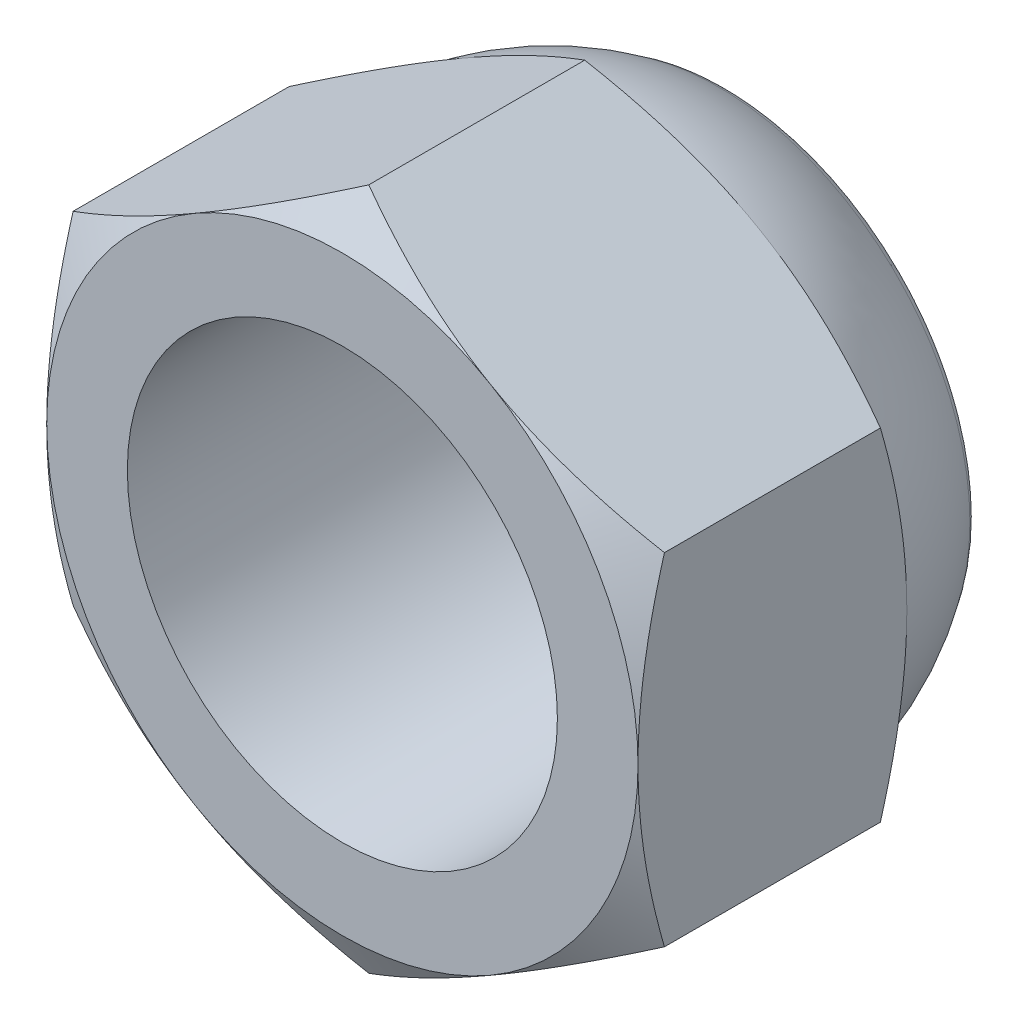
ISO-10303-21;
HEADER;
FILE_DESCRIPTION(('STEP AP214'),'2;1');
FILE_NAME('part.step','',(''),(''),'','','');
FILE_SCHEMA(('AUTOMOTIVE_DESIGN { 1 0 10303 214 1 1 1 1 }'));
ENDSEC;
DATA;
#1=APPLICATION_CONTEXT('core data for automotive mechanical design processes');
#2=APPLICATION_PROTOCOL_DEFINITION('international standard','automotive_design',2000,#1);
#3=PRODUCT_CONTEXT('',#1,'mechanical');
#4=PRODUCT('Part','Part','',(#3));
#5=PRODUCT_RELATED_PRODUCT_CATEGORY('part','',(#4));
#6=PRODUCT_DEFINITION_FORMATION('','',#4);
#7=PRODUCT_DEFINITION_CONTEXT('part definition',#1,'design');
#8=PRODUCT_DEFINITION('design','',#6,#7);
#9=PRODUCT_DEFINITION_SHAPE('','',#8);
#10=(LENGTH_UNIT() NAMED_UNIT(*) SI_UNIT(.MILLI.,.METRE.));
#11=(NAMED_UNIT(*) PLANE_ANGLE_UNIT() SI_UNIT($,.RADIAN.));
#12=(NAMED_UNIT(*) SI_UNIT($,.STERADIAN.) SOLID_ANGLE_UNIT());
#13=UNCERTAINTY_MEASURE_WITH_UNIT(LENGTH_MEASURE(1.E-05),#10,'distance_accuracy_value','');
#14=(GEOMETRIC_REPRESENTATION_CONTEXT(3) GLOBAL_UNCERTAINTY_ASSIGNED_CONTEXT((#13)) GLOBAL_UNIT_ASSIGNED_CONTEXT((#10,
#11,#12)) REPRESENTATION_CONTEXT('',''));
#15=CARTESIAN_POINT('',(0.,0.,0.));
#16=DIRECTION('',(0.,0.,1.));
#17=DIRECTION('',(1.,0.,0.));
#18=AXIS2_PLACEMENT_3D('',#15,#16,#17);
#19=CARTESIAN_POINT('',(0.,3.17542648054295,0.));
#20=DIRECTION('',(0.,0.,-1.));
#21=DIRECTION('',(-1.,0.,0.));
#22=AXIS2_PLACEMENT_3D('',#19,#20,#21);
#23=PLANE('',#22);
#24=CARTESIAN_POINT('',(0.,0.,0.));
#25=DIRECTION('',(0.,0.,-1.));
#26=DIRECTION('',(-1.,0.,0.));
#27=AXIS2_PLACEMENT_3D('',#24,#25,#26);
#28=CIRCLE('',#27,2.);
#29=CARTESIAN_POINT('',(-2.,0.,0.));
#30=VERTEX_POINT('',#29);
#31=EDGE_CURVE('E41',#30,#30,#28,.T.);
#32=ORIENTED_EDGE('',*,*,#31,.T.);
#33=EDGE_LOOP('',(#32));
#34=FACE_BOUND('',#33,.T.);
#35=CARTESIAN_POINT('',(0.,0.,0.));
#36=DIRECTION('',(0.,0.,-1.));
#37=DIRECTION('',(-1.,0.,0.));
#38=AXIS2_PLACEMENT_3D('',#35,#36,#37);
#39=CIRCLE('',#38,2.75);
#40=CARTESIAN_POINT('',(-2.75,0.,0.));
#41=VERTEX_POINT('',#40);
#42=CARTESIAN_POINT('',(-1.37500000000001,2.3815698604072,0.));
#43=VERTEX_POINT('',#42);
#44=EDGE_CURVE('E11',#41,#43,#39,.T.);
#45=ORIENTED_EDGE('',*,*,#44,.F.);
#46=CARTESIAN_POINT('',(-1.37500000000002,-2.3815698604072,0.));
#47=VERTEX_POINT('',#46);
#48=EDGE_CURVE('E47',#47,#41,#39,.T.);
#49=ORIENTED_EDGE('',*,*,#48,.F.);
#50=CARTESIAN_POINT('',(1.375,-2.3815698604072,0.));
#51=VERTEX_POINT('',#50);
#52=EDGE_CURVE('E298',#51,#47,#39,.T.);
#53=ORIENTED_EDGE('',*,*,#52,.F.);
#54=CARTESIAN_POINT('',(2.75,0.,0.));
#55=VERTEX_POINT('',#54);
#56=EDGE_CURVE('E303',#55,#51,#39,.T.);
#57=ORIENTED_EDGE('',*,*,#56,.F.);
#58=CARTESIAN_POINT('',(0.,0.,0.));
#59=DIRECTION('',(0.,0.,1.));
#60=DIRECTION('',(1.,0.,0.));
#61=AXIS2_PLACEMENT_3D('',#58,#59,#60);
#62=CIRCLE('',#61,2.75);
#63=CARTESIAN_POINT('',(1.37500000000002,2.38156986040719,0.));
#64=VERTEX_POINT('',#63);
#65=EDGE_CURVE('E329',#55,#64,#62,.T.);
#66=ORIENTED_EDGE('',*,*,#65,.T.);
#67=EDGE_CURVE('E46',#43,#64,#39,.T.);
#68=ORIENTED_EDGE('',*,*,#67,.F.);
#69=EDGE_LOOP('',(#45,#49,#53,#57,#66,#68));
#70=FACE_BOUND('',#69,.T.);
#71=ADVANCED_FACE('F36',(#34,#70),#23,.F.);
#72=CARTESIAN_POINT('',(0.,3.17542648054295,-2.5));
#73=DIRECTION('',(-0.500000000000004,0.866025403784437,0.));
#74=DIRECTION('',(-0.866025403784437,-0.500000000000004,0.));
#75=AXIS2_PLACEMENT_3D('',#72,#73,#74);
#76=PLANE('',#75);
#77=DIRECTION('',(0.,0.,1.));
#78=VECTOR('',#77,1.);
#79=CARTESIAN_POINT('',(-2.75,1.58771324027146,-2.5));
#80=LINE('',#79,#78);
#81=CARTESIAN_POINT('',(-2.75,1.58771324027149,-2.25437990693813));
#82=VERTEX_POINT('',#81);
#83=CARTESIAN_POINT('',(-2.75,1.58771324027146,-0.245620093061863));
#84=VERTEX_POINT('',#83);
#85=EDGE_CURVE('E293',#82,#84,#80,.T.);
#86=ORIENTED_EDGE('',*,*,#85,.T.);
#87=CARTESIAN_POINT('',(-2.7502,1.58759777021762,-0.245686763364762));
#88=CARTESIAN_POINT('',(-2.62935077934009,1.65737010029698,-0.205387662249264));
#89=CARTESIAN_POINT('',(-2.50745839737737,1.72774469983532,-0.168736902597662));
#90=CARTESIAN_POINT('',(-2.26156287327211,1.86971254687002,-0.1047621829698));
#91=CARTESIAN_POINT('',(-2.13755536142614,1.94130831721582,-0.0774608556744959));
#92=CARTESIAN_POINT('',(-1.89107720202406,2.08361254889598,-0.0349617452941148));
#93=CARTESIAN_POINT('',(-1.76864448141258,2.15429911309864,-0.0194811186224558));
#94=CARTESIAN_POINT('',(-1.52320285763109,2.29600490065922,-0.00099939736993863));
#95=CARTESIAN_POINT('',(-1.40019484676709,2.36702360884403,0.00201700053740195));
#96=CARTESIAN_POINT('',(-1.17034121338921,2.49972966594897,-0.00425314542854563));
#97=CARTESIAN_POINT('',(-1.06346120874598,2.56143686540072,-0.0120001542767018));
#98=CARTESIAN_POINT('',(-0.850397532665248,2.68444923614047,-0.0365551810643557));
#99=CARTESIAN_POINT('',(-0.744214598351108,2.74575398185008,-0.0533715896505722));
#100=CARTESIAN_POINT('',(-0.530711510606812,2.86902004703207,-0.0954119223459603));
#101=CARTESIAN_POINT('',(-0.423418383857139,2.93096576264319,-0.120814080687236));
#102=CARTESIAN_POINT('',(-0.210432520715941,3.05393320806134,-0.178467225839989));
#103=CARTESIAN_POINT('',(-0.104737054973339,3.11495651365996,-0.210704663298991));
#104=CARTESIAN_POINT('',(0.000200000000009354,3.17554195059679,-0.245686763364771));
#105=B_SPLINE_CURVE_WITH_KNOTS('',3,(#87,#88,#89,#90,#91,#92,#93,#94,#95,#96,#97,#98,#99,#100,
#101,#102,#103,#104),.UNSPECIFIED.,.F.,.F.,(4,2,2,2,2,2,2,2,4),(0.,0.435912828725889,
0.872873557116333,1.29901931904672,1.72464171213574,2.09526089052938,2.46622354066375,
2.84541551798559,3.22386274754526),.UNSPECIFIED.);
#106=EDGE_CURVE('E256',#84,#43,#105,.T.);
#107=ORIENTED_EDGE('',*,*,#106,.T.);
#108=CARTESIAN_POINT('',(0.,3.17542648054295,-0.245620093061873));
#109=VERTEX_POINT('',#108);
#110=EDGE_CURVE('E54',#43,#109,#105,.T.);
#111=ORIENTED_EDGE('',*,*,#110,.T.);
#112=DIRECTION('',(0.,0.,1.));
#113=VECTOR('',#112,1.);
#114=CARTESIAN_POINT('',(0.,3.17542648054295,-2.5));
#115=LINE('',#114,#113);
#116=CARTESIAN_POINT('',(0.,3.17542648054295,-2.25437990693813));
#117=VERTEX_POINT('',#116);
#118=EDGE_CURVE('E280',#117,#109,#115,.T.);
#119=ORIENTED_EDGE('',*,*,#118,.F.);
#120=CARTESIAN_POINT('',(-2.7502,1.58759777021762,-2.25431323663524));
#121=CARTESIAN_POINT('',(-2.62935077934009,1.65737010029698,-2.29461233775074));
#122=CARTESIAN_POINT('',(-2.50745839737737,1.72774469983532,-2.33126309740234));
#123=CARTESIAN_POINT('',(-2.26156287327211,1.86971254687002,-2.3952378170302));
#124=CARTESIAN_POINT('',(-2.13755536142615,1.94130831721582,-2.42253914432551));
#125=CARTESIAN_POINT('',(-1.89107720202406,2.08361254889598,-2.46503825470589));
#126=CARTESIAN_POINT('',(-1.76864448141258,2.15429911309863,-2.48051888137754));
#127=CARTESIAN_POINT('',(-1.52320285763109,2.29600490065922,-2.49900060263006));
#128=CARTESIAN_POINT('',(-1.40019484676709,2.36702360884403,-2.5020170005374));
#129=CARTESIAN_POINT('',(-1.17034121338921,2.49972966594897,-2.49574685457145));
#130=CARTESIAN_POINT('',(-1.06346120874598,2.56143686540072,-2.4879998457233));
#131=CARTESIAN_POINT('',(-0.85039753266525,2.68444923614047,-2.46344481893565));
#132=CARTESIAN_POINT('',(-0.744214598351109,2.74575398185008,-2.44662841034943));
#133=CARTESIAN_POINT('',(-0.530711510606812,2.86902004703207,-2.40458807765404));
#134=CARTESIAN_POINT('',(-0.42341838385714,2.93096576264319,-2.37918591931277));
#135=CARTESIAN_POINT('',(-0.210432520715941,3.05393320806134,-2.32153277416001));
#136=CARTESIAN_POINT('',(-0.104737054973339,3.11495651365996,-2.28929533670101));
#137=CARTESIAN_POINT('',(0.000200000000009504,3.17554195059679,-2.25431323663523));
#138=B_SPLINE_CURVE_WITH_KNOTS('',3,(#120,#121,#122,#123,#124,#125,#126,#127,#128,#129,#130,
#131,#132,#133,#134,#135,#136,#137),.UNSPECIFIED.,.F.,.F.,(4,2,2,2,2,2,2,2,4),(0.,
0.435912828725888,0.872873557116332,1.29901931904671,1.72464171213573,2.09526089052938,
2.46622354066375,2.84541551798559,3.22386274754526),.UNSPECIFIED.);
#139=CARTESIAN_POINT('',(-1.37500000000001,2.38156986040721,-2.5));
#140=VERTEX_POINT('',#139);
#141=EDGE_CURVE('E165',#140,#117,#138,.T.);
#142=ORIENTED_EDGE('',*,*,#141,.F.);
#143=EDGE_CURVE('E148',#82,#140,#138,.T.);
#144=ORIENTED_EDGE('',*,*,#143,.F.);
#145=EDGE_LOOP('',(#86,#107,#111,#119,#142,#144));
#146=FACE_BOUND('',#145,.T.);
#147=ADVANCED_FACE('F38',(#146),#76,.T.);
#148=CARTESIAN_POINT('',(2.75,1.58771324027145,-2.5));
#149=DIRECTION('',(0.500000000000009,0.866025403784433,0.));
#150=DIRECTION('',(-0.866025403784433,0.500000000000009,0.));
#151=AXIS2_PLACEMENT_3D('',#148,#149,#150);
#152=PLANE('',#151);
#153=ORIENTED_EDGE('',*,*,#118,.T.);
#154=CARTESIAN_POINT('',(-0.000199999999990853,3.17554195059679,-0.245686763364771));
#155=CARTESIAN_POINT('',(0.120649220659915,3.10576962051743,-0.205387662249272));
#156=CARTESIAN_POINT('',(0.242541602622642,3.03539502097909,-0.16873690259767));
#157=CARTESIAN_POINT('',(0.488437126727901,2.89342717394439,-0.104762182969806));
#158=CARTESIAN_POINT('',(0.612444638573864,2.82183140359859,-0.0774608556745009));
#159=CARTESIAN_POINT('',(0.858922797975952,2.67952717191842,-0.0349617452941181));
#160=CARTESIAN_POINT('',(0.981355518587425,2.60884060771577,-0.0194811186224582));
#161=CARTESIAN_POINT('',(1.22679714236892,2.46713482015518,-0.000999397369939208));
#162=CARTESIAN_POINT('',(1.34980515323292,2.39611611197037,0.00201700053740231));
#163=CARTESIAN_POINT('',(1.5796587866108,2.26341005486543,-0.00425314542854391));
#164=CARTESIAN_POINT('',(1.68653879125403,2.20170285541367,-0.0120001542766995));
#165=CARTESIAN_POINT('',(1.89960246733476,2.07869048467393,-0.0365551810643516));
#166=CARTESIAN_POINT('',(2.00578540164889,2.01738573896432,-0.053371589650567));
#167=CARTESIAN_POINT('',(2.21928848939319,1.89411967378233,-0.0954119223459532));
#168=CARTESIAN_POINT('',(2.32658161614286,1.83217395817121,-0.120814080687228));
#169=CARTESIAN_POINT('',(2.53956747928405,1.70920651275305,-0.17846722583998));
#170=CARTESIAN_POINT('',(2.64526294502665,1.64818320715444,-0.210704663298981));
#171=CARTESIAN_POINT('',(2.7502,1.58759777021761,-0.245686763364759));
#172=B_SPLINE_CURVE_WITH_KNOTS('',3,(#154,#155,#156,#157,#158,#159,#160,#161,#162,#163,#164,
#165,#166,#167,#168,#169,#170,#171),.UNSPECIFIED.,.F.,.F.,(4,2,2,2,2,2,2,2,4),(0.,
0.435912828725891,0.872873557116338,1.29901931904672,1.72464171213575,2.09526089052939,
2.46622354066375,2.84541551798558,3.22386274754526),.UNSPECIFIED.);
#173=EDGE_CURVE('E268',#109,#64,#172,.T.);
#174=ORIENTED_EDGE('',*,*,#173,.T.);
#175=CARTESIAN_POINT('',(2.75,1.58771324027149,-0.245620093061873));
#176=VERTEX_POINT('',#175);
#177=EDGE_CURVE('E61',#64,#176,#172,.T.);
#178=ORIENTED_EDGE('',*,*,#177,.T.);
#179=DIRECTION('',(0.,0.,1.));
#180=VECTOR('',#179,1.);
#181=CARTESIAN_POINT('',(2.75,1.58771324027145,-2.5));
#182=LINE('',#181,#180);
#183=CARTESIAN_POINT('',(2.75,1.58771324027149,-2.25437990693813));
#184=VERTEX_POINT('',#183);
#185=EDGE_CURVE('E284',#184,#176,#182,.T.);
#186=ORIENTED_EDGE('',*,*,#185,.F.);
#187=CARTESIAN_POINT('',(-0.000199999999990713,3.17554195059679,-2.25431323663523));
#188=CARTESIAN_POINT('',(0.120649220659915,3.10576962051743,-2.29461233775073));
#189=CARTESIAN_POINT('',(0.242541602622642,3.03539502097909,-2.33126309740233));
#190=CARTESIAN_POINT('',(0.488437126727901,2.89342717394439,-2.3952378170302));
#191=CARTESIAN_POINT('',(0.612444638573863,2.82183140359859,-2.4225391443255));
#192=CARTESIAN_POINT('',(0.85892279797595,2.67952717191842,-2.46503825470588));
#193=CARTESIAN_POINT('',(0.981355518587423,2.60884060771577,-2.48051888137754));
#194=CARTESIAN_POINT('',(1.22679714236892,2.46713482015518,-2.49900060263006));
#195=CARTESIAN_POINT('',(1.34980515323292,2.39611611197037,-2.5020170005374));
#196=CARTESIAN_POINT('',(1.5796587866108,2.26341005486543,-2.49574685457146));
#197=CARTESIAN_POINT('',(1.68653879125403,2.20170285541368,-2.4879998457233));
#198=CARTESIAN_POINT('',(1.89960246733475,2.07869048467393,-2.46344481893565));
#199=CARTESIAN_POINT('',(2.00578540164889,2.01738573896432,-2.44662841034943));
#200=CARTESIAN_POINT('',(2.21928848939319,1.89411967378233,-2.40458807765405));
#201=CARTESIAN_POINT('',(2.32658161614286,1.83217395817121,-2.37918591931277));
#202=CARTESIAN_POINT('',(2.53956747928405,1.70920651275305,-2.32153277416002));
#203=CARTESIAN_POINT('',(2.64526294502666,1.64818320715444,-2.28929533670102));
#204=CARTESIAN_POINT('',(2.7502,1.58759777021761,-2.25431323663524));
#205=B_SPLINE_CURVE_WITH_KNOTS('',3,(#187,#188,#189,#190,#191,#192,#193,#194,#195,#196,#197,
#198,#199,#200,#201,#202,#203,#204),.UNSPECIFIED.,.F.,.F.,(4,2,2,2,2,2,2,2,4),(0.,
0.43591282872589,0.872873557116336,1.29901931904672,1.72464171213574,2.09526089052938,
2.46622354066375,2.84541551798558,3.22386274754526),.UNSPECIFIED.);
#206=CARTESIAN_POINT('',(1.37500000000003,2.38156986040719,-2.5));
#207=VERTEX_POINT('',#206);
#208=EDGE_CURVE('E143',#207,#184,#205,.T.);
#209=ORIENTED_EDGE('',*,*,#208,.F.);
#210=EDGE_CURVE('E279',#117,#207,#205,.T.);
#211=ORIENTED_EDGE('',*,*,#210,.F.);
#212=EDGE_LOOP('',(#153,#174,#178,#186,#209,#211));
#213=FACE_BOUND('',#212,.T.);
#214=ADVANCED_FACE('F269',(#213),#152,.T.);
#215=CARTESIAN_POINT('',(2.75,1.58771324027145,-2.5));
#216=DIRECTION('',(-1.,0.,0.));
#217=DIRECTION('',(0.,0.,1.));
#218=AXIS2_PLACEMENT_3D('',#215,#216,#217);
#219=PLANE('',#218);
#220=CARTESIAN_POINT('',(2.75,-4.2108494930968,-1.31594843960298));
#221=CARTESIAN_POINT('',(2.75,-4.09010894214094,-1.25759993615228));
#222=CARTESIAN_POINT('',(2.75,-3.96908292065513,-1.19983146511762));
#223=CARTESIAN_POINT('',(2.75,-3.72630558284848,-1.08578603842309));
#224=CARTESIAN_POINT('',(2.75,-3.60455414536204,-1.02950934100251));
#225=CARTESIAN_POINT('',(2.75,-3.35951393034358,-0.91848244335279));
#226=CARTESIAN_POINT('',(2.75,-3.2362203423644,-0.86374282160587));
#227=CARTESIAN_POINT('',(2.75,-2.98861980138747,-0.756614777476483));
#228=CARTESIAN_POINT('',(2.75,-2.86431290161186,-0.704226232536791));
#229=CARTESIAN_POINT('',(2.75,-2.61294485887175,-0.601803572146148));
#230=CARTESIAN_POINT('',(2.75,-2.48586863815658,-0.551806257898417));
#231=CARTESIAN_POINT('',(2.75,-2.23021732171544,-0.455727408784622));
#232=CARTESIAN_POINT('',(2.75,-2.10164206103367,-0.409646309576991));
#233=CARTESIAN_POINT('',(2.75,-1.8430521879947,-0.322638077046248));
#234=CARTESIAN_POINT('',(2.75,-1.71304130052586,-0.281699986413904));
#235=CARTESIAN_POINT('',(2.75,-1.45117125062151,-0.206307307624361));
#236=CARTESIAN_POINT('',(2.75,-1.31931268690205,-0.171850669152779));
#237=CARTESIAN_POINT('',(2.75,-1.05365722480015,-0.111093671530913));
#238=CARTESIAN_POINT('',(2.75,-0.919859820217618,-0.0847954840951296));
#239=CARTESIAN_POINT('',(2.75,-0.650651874037407,-0.0421260371966173));
#240=CARTESIAN_POINT('',(2.75,-0.51524133101362,-0.0257547865105482));
#241=CARTESIAN_POINT('',(2.75,-0.244373242869234,-0.00438749654024083));
#242=CARTESIAN_POINT('',(2.75,-0.108921526377156,0.000680556773213286));
#243=CARTESIAN_POINT('',(2.75,0.161887058855113,-0.000827795632673346));
#244=CARTESIAN_POINT('',(2.75,0.297243943089621,-0.00740117868555447));
#245=CARTESIAN_POINT('',(2.75,0.528385436717521,-0.0281041300468438));
#246=CARTESIAN_POINT('',(2.75,0.624425050137477,-0.0395376410301878));
#247=CARTESIAN_POINT('',(2.75,0.815762399811515,-0.0675217196133493));
#248=CARTESIAN_POINT('',(2.75,0.911060016631936,-0.08407309422768));
#249=CARTESIAN_POINT('',(2.75,1.19576218748913,-0.14053536127828));
#250=CARTESIAN_POINT('',(2.75,1.38383224738492,-0.187239859417288));
#251=CARTESIAN_POINT('',(2.75,1.6652504894748,-0.26779249703057));
#252=CARTESIAN_POINT('',(2.75,1.76006556248553,-0.296803334995491));
#253=CARTESIAN_POINT('',(2.75,1.9487060938221,-0.357695648906576));
#254=CARTESIAN_POINT('',(2.75,2.0425321855369,-0.389575144878491));
#255=CARTESIAN_POINT('',(2.75,2.22880240354978,-0.455541418186435));
#256=CARTESIAN_POINT('',(2.75,2.32125133588445,-0.489614761455518));
#257=CARTESIAN_POINT('',(2.75,2.50543192042622,-0.559761368231093));
#258=CARTESIAN_POINT('',(2.75,2.59716326539572,-0.595835440037301));
#259=CARTESIAN_POINT('',(2.75,2.68856293053338,-0.632712441997466));
#260=B_SPLINE_CURVE_WITH_KNOTS('',3,(#220,#221,#222,#223,#224,#225,#226,#227,#228,#229,#230,
#231,#232,#233,#234,#235,#236,#237,#238,#239,#240,#241,#242,#243,#244,#245,#246,#247,#248,#249,
#250,#251,#252,#253,#254,#255,#256,#257,#258,#259),.UNSPECIFIED.,.F.,.F.,(4,2,2,2,2,2,2,2,2,2,2,
2,2,2,2,2,2,2,2,4),(0.,0.402305607365938,0.804680408537001,1.20935783819119,1.61401414820819,
2.02363838185771,2.4333081245735,2.84208969479602,3.25074173456638,3.65950246109146,
4.06826354901186,4.47441284024653,4.88045669141175,5.17046846817548,5.46052599902454,
6.04107275309883,6.33851131304661,6.63574613017454,6.9313079100579,7.2269899800482),.UNSPECIFIED.);
#261=CARTESIAN_POINT('',(2.74999999999998,-1.58771324027152,-0.245620093061873));
#262=VERTEX_POINT('',#261);
#263=EDGE_CURVE('E250',#262,#55,#260,.T.);
#264=ORIENTED_EDGE('',*,*,#263,.F.);
#265=DIRECTION('',(0.,0.,1.));
#266=VECTOR('',#265,1.);
#267=CARTESIAN_POINT('',(2.75,-1.58771324027151,-2.5));
#268=LINE('',#267,#266);
#269=CARTESIAN_POINT('',(2.74999999999998,-1.58771324027152,-2.25437990693813));
#270=VERTEX_POINT('',#269);
#271=EDGE_CURVE('E162',#270,#262,#268,.T.);
#272=ORIENTED_EDGE('',*,*,#271,.F.);
#273=CARTESIAN_POINT('',(2.75,-4.2108494930968,-1.18405156039704));
#274=CARTESIAN_POINT('',(2.75,-4.09010894214094,-1.24240006384774));
#275=CARTESIAN_POINT('',(2.75,-3.96908292065513,-1.30016853488239));
#276=CARTESIAN_POINT('',(2.75,-3.72630558284847,-1.41421396157693));
#277=CARTESIAN_POINT('',(2.75,-3.60455414536204,-1.47049065899751));
#278=CARTESIAN_POINT('',(2.75,-3.35951393034358,-1.58151755664722));
#279=CARTESIAN_POINT('',(2.75,-3.2362203423644,-1.63625717839414));
#280=CARTESIAN_POINT('',(2.75,-2.98861980138747,-1.74338522252353));
#281=CARTESIAN_POINT('',(2.75,-2.86431290161185,-1.79577376746322));
#282=CARTESIAN_POINT('',(2.75,-2.61294485887175,-1.89819642785386));
#283=CARTESIAN_POINT('',(2.75,-2.48586863815658,-1.94819374210159));
#284=CARTESIAN_POINT('',(2.75,-2.23021732171544,-2.04427259121539));
#285=CARTESIAN_POINT('',(2.75,-2.10164206103366,-2.09035369042302));
#286=CARTESIAN_POINT('',(2.75,-1.8430521879947,-2.17736192295376));
#287=CARTESIAN_POINT('',(2.75,-1.71304130052586,-2.2183000135861));
#288=CARTESIAN_POINT('',(2.75,-1.45117125062151,-2.29369269237564));
#289=CARTESIAN_POINT('',(2.75,-1.31931268690205,-2.32814933084722));
#290=CARTESIAN_POINT('',(2.75,-1.05365722480015,-2.38890632846909));
#291=CARTESIAN_POINT('',(2.75,-0.919859820217619,-2.41520451590487));
#292=CARTESIAN_POINT('',(2.75,-0.650651874037408,-2.45787396280338));
#293=CARTESIAN_POINT('',(2.75,-0.515241331013621,-2.47424521348945));
#294=CARTESIAN_POINT('',(2.75,-0.244373242869236,-2.49561250345976));
#295=CARTESIAN_POINT('',(2.75,-0.108921526377157,-2.50068055677321));
#296=CARTESIAN_POINT('',(2.75,0.161887058855112,-2.49917220436733));
#297=CARTESIAN_POINT('',(2.75,0.297243943089618,-2.49259882131445));
#298=CARTESIAN_POINT('',(2.75,0.52838543671752,-2.47189586995316));
#299=CARTESIAN_POINT('',(2.75,0.624425050137477,-2.46046235896981));
#300=CARTESIAN_POINT('',(2.75,0.815762399811518,-2.43247828038665));
#301=CARTESIAN_POINT('',(2.75,0.911060016631939,-2.41592690577232));
#302=CARTESIAN_POINT('',(2.75,1.19576218748913,-2.35946463872172));
#303=CARTESIAN_POINT('',(2.75,1.38383224738494,-2.31276014058271));
#304=CARTESIAN_POINT('',(2.75,1.66525048947482,-2.23220750296943));
#305=CARTESIAN_POINT('',(2.75,1.76006556248554,-2.20319666500451));
#306=CARTESIAN_POINT('',(2.75,1.94870609382212,-2.14230435109342));
#307=CARTESIAN_POINT('',(2.75,2.04253218553692,-2.11042485512151));
#308=CARTESIAN_POINT('',(2.75,2.22880240354981,-2.04445858181356));
#309=CARTESIAN_POINT('',(2.75,2.32125133588447,-2.01038523854448));
#310=CARTESIAN_POINT('',(2.75,2.50543192042624,-1.9402386317689));
#311=CARTESIAN_POINT('',(2.75,2.59716326539575,-1.9041645599627));
#312=CARTESIAN_POINT('',(2.75,2.68856293053341,-1.86728755800253));
#313=B_SPLINE_CURVE_WITH_KNOTS('',3,(#273,#274,#275,#276,#277,#278,#279,#280,#281,#282,#283,
#284,#285,#286,#287,#288,#289,#290,#291,#292,#293,#294,#295,#296,#297,#298,#299,#300,#301,#302,
#303,#304,#305,#306,#307,#308,#309,#310,#311,#312),.UNSPECIFIED.,.F.,.F.,(4,2,2,2,2,2,2,2,2,2,2,
2,2,2,2,2,2,2,2,4),(0.,0.402305607365938,0.804680408537,1.20935783819118,1.61401414820819,
2.02363838185771,2.4333081245735,2.84208969479602,3.25074173456638,3.65950246109145,
4.06826354901186,4.47441284024652,4.88045669141174,5.17046846817548,5.46052599902454,
6.04107275309884,6.33851131304662,6.63574613017455,6.93130791005792,7.22698998004822),.UNSPECIFIED.);
#314=CARTESIAN_POINT('',(2.75,0.,-2.5));
#315=VERTEX_POINT('',#314);
#316=EDGE_CURVE('E150',#270,#315,#313,.T.);
#317=ORIENTED_EDGE('',*,*,#316,.T.);
#318=EDGE_CURVE('E141',#315,#184,#313,.T.);
#319=ORIENTED_EDGE('',*,*,#318,.T.);
#320=ORIENTED_EDGE('',*,*,#185,.T.);
#321=EDGE_CURVE('E257',#55,#176,#260,.T.);
#322=ORIENTED_EDGE('',*,*,#321,.F.);
#323=EDGE_LOOP('',(#264,#272,#317,#319,#320,#322));
#324=FACE_BOUND('',#323,.T.);
#325=ADVANCED_FACE('F160',(#324),#219,.F.);
#326=CARTESIAN_POINT('',(0.,-3.17542648054299,-2.5));
#327=DIRECTION('',(0.500000000000002,-0.866025403784438,0.));
#328=DIRECTION('',(0.866025403784438,0.500000000000002,0.));
#329=AXIS2_PLACEMENT_3D('',#326,#327,#328);
#330=PLANE('',#329);
#331=ORIENTED_EDGE('',*,*,#271,.T.);
#332=CARTESIAN_POINT('',(2.7502,-1.58759777021767,-0.245686763364776));
#333=CARTESIAN_POINT('',(2.6293507793401,-1.65737010029702,-0.205387662249279));
#334=CARTESIAN_POINT('',(2.50745839737737,-1.72774469983537,-0.168736902597678));
#335=CARTESIAN_POINT('',(2.26156287327211,-1.86971254687007,-0.104762182969816));
#336=CARTESIAN_POINT('',(2.13755536142614,-1.94130831721587,-0.0774608556745131));
#337=CARTESIAN_POINT('',(1.89107720202405,-2.08361254889603,-0.0349617452941333));
#338=CARTESIAN_POINT('',(1.76864448141258,-2.15429911309868,-0.0194811186224748));
#339=CARTESIAN_POINT('',(1.52320285763108,-2.29600490065927,-0.000999397369959125));
#340=CARTESIAN_POINT('',(1.40019484676708,-2.36702360884408,0.00201700053738049));
#341=CARTESIAN_POINT('',(1.1703412133892,-2.49972966594901,-0.00425314542856856));
#342=CARTESIAN_POINT('',(1.06346120874597,-2.56143686540077,-0.012000154276725));
#343=CARTESIAN_POINT('',(0.850397532665243,-2.68444923614051,-0.0365551810643791));
#344=CARTESIAN_POINT('',(0.744214598351104,-2.74575398185012,-0.0533715896505955));
#345=CARTESIAN_POINT('',(0.530711510606811,-2.86902004703211,-0.0954119223459832));
#346=CARTESIAN_POINT('',(0.42341838385714,-2.93096576264323,-0.120814080687258));
#347=CARTESIAN_POINT('',(0.210432520715946,-3.05393320806138,-0.178467225840011));
#348=CARTESIAN_POINT('',(0.104737054973345,-3.11495651366,-0.210704663299012));
#349=CARTESIAN_POINT('',(-0.000200000000002151,-3.17554195059682,-0.245686763364791));
#350=B_SPLINE_CURVE_WITH_KNOTS('',3,(#332,#333,#334,#335,#336,#337,#338,#339,#340,#341,#342,
#343,#344,#345,#346,#347,#348,#349),.UNSPECIFIED.,.F.,.F.,(4,2,2,2,2,2,2,2,4),(0.,
0.435912828725892,0.872873557116341,1.29901931904673,1.72464171213575,2.09526089052939,
2.46622354066376,2.84541551798558,3.22386274754525),.UNSPECIFIED.);
#351=EDGE_CURVE('E249',#262,#51,#350,.T.);
#352=ORIENTED_EDGE('',*,*,#351,.T.);
#353=CARTESIAN_POINT('',(0.,-3.17542648054295,-0.245620093061873));
#354=VERTEX_POINT('',#353);
#355=EDGE_CURVE('E242',#51,#354,#350,.T.);
#356=ORIENTED_EDGE('',*,*,#355,.T.);
#357=DIRECTION('',(0.,0.,1.));
#358=VECTOR('',#357,1.);
#359=CARTESIAN_POINT('',(0.,-3.17542648054299,-2.5));
#360=LINE('',#359,#358);
#361=CARTESIAN_POINT('',(0.,-3.17542648054295,-2.25437990693813));
#362=VERTEX_POINT('',#361);
#363=EDGE_CURVE('E287',#362,#354,#360,.T.);
#364=ORIENTED_EDGE('',*,*,#363,.F.);
#365=CARTESIAN_POINT('',(2.7502,-1.58759777021767,-2.25431323663523));
#366=CARTESIAN_POINT('',(2.6293507793401,-1.65737010029702,-2.29461233775072));
#367=CARTESIAN_POINT('',(2.50745839737737,-1.72774469983537,-2.33126309740233));
#368=CARTESIAN_POINT('',(2.26156287327211,-1.86971254687006,-2.39523781703019));
#369=CARTESIAN_POINT('',(2.13755536142614,-1.94130831721587,-2.42253914432549));
#370=CARTESIAN_POINT('',(1.89107720202405,-2.08361254889603,-2.46503825470587));
#371=CARTESIAN_POINT('',(1.76864448141258,-2.15429911309868,-2.48051888137753));
#372=CARTESIAN_POINT('',(1.52320285763108,-2.29600490065927,-2.49900060263004));
#373=CARTESIAN_POINT('',(1.40019484676708,-2.36702360884408,-2.50201700053738));
#374=CARTESIAN_POINT('',(1.1703412133892,-2.49972966594901,-2.49574685457143));
#375=CARTESIAN_POINT('',(1.06346120874597,-2.56143686540077,-2.48799984572328));
#376=CARTESIAN_POINT('',(0.850397532665244,-2.68444923614051,-2.46344481893562));
#377=CARTESIAN_POINT('',(0.744214598351105,-2.74575398185012,-2.44662841034941));
#378=CARTESIAN_POINT('',(0.530711510606812,-2.86902004703211,-2.40458807765402));
#379=CARTESIAN_POINT('',(0.423418383857141,-2.93096576264323,-2.37918591931274));
#380=CARTESIAN_POINT('',(0.210432520715946,-3.05393320806138,-2.32153277415999));
#381=CARTESIAN_POINT('',(0.104737054973345,-3.11495651366,-2.28929533670099));
#382=CARTESIAN_POINT('',(-0.000200000000002157,-3.17554195059682,-2.25431323663521));
#383=B_SPLINE_CURVE_WITH_KNOTS('',3,(#365,#366,#367,#368,#369,#370,#371,#372,#373,#374,#375,
#376,#377,#378,#379,#380,#381,#382),.UNSPECIFIED.,.F.,.F.,(4,2,2,2,2,2,2,2,4),(0.,
0.435912828725891,0.872873557116339,1.29901931904673,1.72464171213575,2.09526089052939,
2.46622354066375,2.84541551798558,3.22386274754525),.UNSPECIFIED.);
#384=CARTESIAN_POINT('',(1.37500000000001,-2.38156986040721,-2.5));
#385=VERTEX_POINT('',#384);
#386=EDGE_CURVE('E166',#385,#362,#383,.T.);
#387=ORIENTED_EDGE('',*,*,#386,.F.);
#388=EDGE_CURVE('E154',#270,#385,#383,.T.);
#389=ORIENTED_EDGE('',*,*,#388,.F.);
#390=EDGE_LOOP('',(#331,#352,#356,#364,#387,#389));
#391=FACE_BOUND('',#390,.T.);
#392=ADVANCED_FACE('F220',(#391),#330,.T.);
#393=CARTESIAN_POINT('',(-2.75,-1.58771324027149,-2.5));
#394=DIRECTION('',(-0.500000000000006,-0.866025403784435,0.));
#395=DIRECTION('',(0.866025403784435,-0.500000000000006,0.));
#396=AXIS2_PLACEMENT_3D('',#393,#394,#395);
#397=PLANE('',#396);
#398=ORIENTED_EDGE('',*,*,#363,.T.);
#399=CARTESIAN_POINT('',(0.000199999999997729,-3.17554195059682,-0.245686763364791));
#400=CARTESIAN_POINT('',(-0.12064922065991,-3.10576962051747,-0.205387662249292));
#401=CARTESIAN_POINT('',(-0.242541602622639,-3.03539502097912,-0.168736902597689));
#402=CARTESIAN_POINT('',(-0.4884371267279,-2.89342717394442,-0.104762182969824));
#403=CARTESIAN_POINT('',(-0.612444638573865,-2.82183140359862,-0.0774608556745193));
#404=CARTESIAN_POINT('',(-0.858922797975956,-2.67952717191845,-0.0349617452941363));
#405=CARTESIAN_POINT('',(-0.981355518587431,-2.6088406077158,-0.0194811186224764));
#406=CARTESIAN_POINT('',(-1.22679714236893,-2.46713482015521,-0.000999397369957548));
#407=CARTESIAN_POINT('',(-1.34980515323293,-2.3961161119704,0.00201700053738388));
#408=CARTESIAN_POINT('',(-1.57965878661081,-2.26341005486546,-0.00425314542856246));
#409=CARTESIAN_POINT('',(-1.68653879125404,-2.20170285541371,-0.0120001542767178));
#410=CARTESIAN_POINT('',(-1.89960246733476,-2.07869048467397,-0.0365551810643694));
#411=CARTESIAN_POINT('',(-2.0057854016489,-2.01738573896435,-0.0533715896505844));
#412=CARTESIAN_POINT('',(-2.21928848939319,-1.89411967378237,-0.0954119223459692));
#413=CARTESIAN_POINT('',(-2.32658161614286,-1.83217395817125,-0.120814080687243));
#414=CARTESIAN_POINT('',(-2.53956747928405,-1.7092065127531,-0.178467225839993));
#415=CARTESIAN_POINT('',(-2.64526294502665,-1.64818320715448,-0.210704663298993));
#416=CARTESIAN_POINT('',(-2.7502,-1.58759777021765,-0.245686763364771));
#417=B_SPLINE_CURVE_WITH_KNOTS('',3,(#399,#400,#401,#402,#403,#404,#405,#406,#407,#408,#409,
#410,#411,#412,#413,#414,#415,#416),.UNSPECIFIED.,.F.,.F.,(4,2,2,2,2,2,2,2,4),(0.,
0.435912828725896,0.872873557116347,1.29901931904674,1.72464171213576,2.0952608905294,
2.46622354066376,2.84541551798559,3.22386274754525),.UNSPECIFIED.);
#418=EDGE_CURVE('E234',#354,#47,#417,.T.);
#419=ORIENTED_EDGE('',*,*,#418,.T.);
#420=CARTESIAN_POINT('',(-2.75,-1.58771324027149,-0.245620093061873));
#421=VERTEX_POINT('',#420);
#422=EDGE_CURVE('E226',#47,#421,#417,.T.);
#423=ORIENTED_EDGE('',*,*,#422,.T.);
#424=DIRECTION('',(0.,0.,1.));
#425=VECTOR('',#424,1.);
#426=CARTESIAN_POINT('',(-2.75,-1.58771324027149,-2.5));
#427=LINE('',#426,#425);
#428=CARTESIAN_POINT('',(-2.75,-1.58771324027149,-2.25437990693813));
#429=VERTEX_POINT('',#428);
#430=EDGE_CURVE('E290',#429,#421,#427,.T.);
#431=ORIENTED_EDGE('',*,*,#430,.F.);
#432=CARTESIAN_POINT('',(0.000199999999997729,-3.17554195059682,-2.25431323663521));
#433=CARTESIAN_POINT('',(-0.120649220659909,-3.10576962051747,-2.29461233775071));
#434=CARTESIAN_POINT('',(-0.242541602622638,-3.03539502097912,-2.33126309740231));
#435=CARTESIAN_POINT('',(-0.4884371267279,-2.89342717394442,-2.39523781703018));
#436=CARTESIAN_POINT('',(-0.612444638573864,-2.82183140359862,-2.42253914432548));
#437=CARTESIAN_POINT('',(-0.858922797975955,-2.67952717191846,-2.46503825470586));
#438=CARTESIAN_POINT('',(-0.981355518587429,-2.6088406077158,-2.48051888137752));
#439=CARTESIAN_POINT('',(-1.22679714236893,-2.46713482015521,-2.49900060263004));
#440=CARTESIAN_POINT('',(-1.34980515323293,-2.3961161119704,-2.50201700053738));
#441=CARTESIAN_POINT('',(-1.57965878661081,-2.26341005486546,-2.49574685457144));
#442=CARTESIAN_POINT('',(-1.68653879125404,-2.20170285541371,-2.48799984572328));
#443=CARTESIAN_POINT('',(-1.89960246733476,-2.07869048467397,-2.46344481893563));
#444=CARTESIAN_POINT('',(-2.0057854016489,-2.01738573896436,-2.44662841034942));
#445=CARTESIAN_POINT('',(-2.21928848939319,-1.89411967378237,-2.40458807765403));
#446=CARTESIAN_POINT('',(-2.32658161614286,-1.83217395817125,-2.37918591931276));
#447=CARTESIAN_POINT('',(-2.53956747928405,-1.7092065127531,-2.32153277416001));
#448=CARTESIAN_POINT('',(-2.64526294502665,-1.64818320715448,-2.28929533670101));
#449=CARTESIAN_POINT('',(-2.7502,-1.58759777021765,-2.25431323663523));
#450=B_SPLINE_CURVE_WITH_KNOTS('',3,(#432,#433,#434,#435,#436,#437,#438,#439,#440,#441,#442,
#443,#444,#445,#446,#447,#448,#449),.UNSPECIFIED.,.F.,.F.,(4,2,2,2,2,2,2,2,4),(0.,
0.435912828725895,0.872873557116345,1.29901931904673,1.72464171213576,2.0952608905294,
2.46622354066376,2.84541551798559,3.22386274754525),.UNSPECIFIED.);
#451=CARTESIAN_POINT('',(-1.37500000000002,-2.3815698604072,-2.5));
#452=VERTEX_POINT('',#451);
#453=EDGE_CURVE('E207',#452,#429,#450,.T.);
#454=ORIENTED_EDGE('',*,*,#453,.F.);
#455=EDGE_CURVE('E214',#362,#452,#450,.T.);
#456=ORIENTED_EDGE('',*,*,#455,.F.);
#457=EDGE_LOOP('',(#398,#419,#423,#431,#454,#456));
#458=FACE_BOUND('',#457,.T.);
#459=ADVANCED_FACE('F216',(#458),#397,.T.);
#460=CARTESIAN_POINT('',(-2.75,1.58771324027146,-2.5));
#461=DIRECTION('',(-1.,0.,0.));
#462=DIRECTION('',(0.,0.,1.));
#463=AXIS2_PLACEMENT_3D('',#460,#461,#462);
#464=PLANE('',#463);
#465=ORIENTED_EDGE('',*,*,#430,.T.);
#466=CARTESIAN_POINT('',(-2.75,-4.21084949309678,-1.31594843960297));
#467=CARTESIAN_POINT('',(-2.75,-4.09010894214092,-1.25759993615227));
#468=CARTESIAN_POINT('',(-2.75,-3.96908292065511,-1.19983146511761));
#469=CARTESIAN_POINT('',(-2.75,-3.72630558284846,-1.08578603842308));
#470=CARTESIAN_POINT('',(-2.75,-3.60455414536202,-1.0295093410025));
#471=CARTESIAN_POINT('',(-2.75,-3.35951393034356,-0.918482443352781));
#472=CARTESIAN_POINT('',(-2.75,-3.23622034236438,-0.86374282160586));
#473=CARTESIAN_POINT('',(-2.75,-2.98861980138745,-0.756614777476474));
#474=CARTESIAN_POINT('',(-2.75,-2.86431290161184,-0.704226232536782));
#475=CARTESIAN_POINT('',(-2.75,-2.61294485887174,-0.601803572146141));
#476=CARTESIAN_POINT('',(-2.75,-2.48586863815656,-0.551806257898409));
#477=CARTESIAN_POINT('',(-2.75,-2.23021732171543,-0.455727408784615));
#478=CARTESIAN_POINT('',(-2.75,-2.10164206103365,-0.409646309576985));
#479=CARTESIAN_POINT('',(-2.75,-1.84305218799469,-0.322638077046242));
#480=CARTESIAN_POINT('',(-2.75,-1.71304130052585,-0.281699986413898));
#481=CARTESIAN_POINT('',(-2.75,-1.45117125062149,-0.206307307624356));
#482=CARTESIAN_POINT('',(-2.75,-1.31931268690204,-0.171850669152774));
#483=CARTESIAN_POINT('',(-2.75,-1.05365722480014,-0.111093671530909));
#484=CARTESIAN_POINT('',(-2.75,-0.919859820217608,-0.0847954840951256));
#485=CARTESIAN_POINT('',(-2.75,-0.650651874037396,-0.0421260371966136));
#486=CARTESIAN_POINT('',(-2.75,-0.51524133101361,-0.0257547865105448));
#487=CARTESIAN_POINT('',(-2.75,-0.244373242869224,-0.00438749654023814));
#488=CARTESIAN_POINT('',(-2.75,-0.108921526377146,0.000680556773215598));
#489=CARTESIAN_POINT('',(-2.75,0.161887058855123,-0.00082779563267165));
#490=CARTESIAN_POINT('',(-2.75,0.29724394308963,-0.00740117868555298));
#491=CARTESIAN_POINT('',(-2.75,0.52838543671753,-0.0281041300468428));
#492=CARTESIAN_POINT('',(-2.75,0.624425050137486,-0.039537641030187));
#493=CARTESIAN_POINT('',(-2.75,0.815762399811525,-0.067521719613349));
#494=CARTESIAN_POINT('',(-2.75,0.911060016631945,-0.0840730942276798));
#495=CARTESIAN_POINT('',(-2.75,1.19576218748914,-0.14053536127828));
#496=CARTESIAN_POINT('',(-2.75,1.38383224738494,-0.187239859417288));
#497=CARTESIAN_POINT('',(-2.75,1.66525048947482,-0.267792497030571));
#498=CARTESIAN_POINT('',(-2.75,1.76006556248554,-0.296803334995493));
#499=CARTESIAN_POINT('',(-2.75,1.94870609382211,-0.357695648906579));
#500=CARTESIAN_POINT('',(-2.75,2.04253218553691,-0.389575144878494));
#501=CARTESIAN_POINT('',(-2.75,2.2288024035498,-0.455541418186437));
#502=CARTESIAN_POINT('',(-2.75,2.32125133588446,-0.489614761455521));
#503=CARTESIAN_POINT('',(-2.75,2.50543192042623,-0.559761368231096));
#504=CARTESIAN_POINT('',(-2.75,2.59716326539573,-0.595835440037304));
#505=CARTESIAN_POINT('',(-2.75,2.6885629305334,-0.63271244199747));
#506=B_SPLINE_CURVE_WITH_KNOTS('',3,(#466,#467,#468,#469,#470,#471,#472,#473,#474,#475,#476,
#477,#478,#479,#480,#481,#482,#483,#484,#485,#486,#487,#488,#489,#490,#491,#492,#493,#494,#495,
#496,#497,#498,#499,#500,#501,#502,#503,#504,#505),.UNSPECIFIED.,.F.,.F.,(4,2,2,2,2,2,2,2,2,2,2,
2,2,2,2,2,2,2,2,4),(0.,0.402305607365938,0.804680408537,1.20935783819118,1.61401414820819,
2.02363838185771,2.43330812457349,2.84208969479601,3.25074173456637,3.65950246109145,
4.06826354901185,4.47441284024652,4.88045669141174,5.17046846817547,5.46052599902453,
6.04107275309882,6.3385113130466,6.63574613017453,6.9313079100579,7.22698998004819),.UNSPECIFIED.);
#507=EDGE_CURVE('E235',#421,#41,#506,.T.);
#508=ORIENTED_EDGE('',*,*,#507,.T.);
#509=EDGE_CURVE('E236',#41,#84,#506,.T.);
#510=ORIENTED_EDGE('',*,*,#509,.T.);
#511=ORIENTED_EDGE('',*,*,#85,.F.);
#512=CARTESIAN_POINT('',(-2.75,-4.21084949309678,-1.18405156039705));
#513=CARTESIAN_POINT('',(-2.75,-4.09010894214092,-1.24240006384775));
#514=CARTESIAN_POINT('',(-2.75,-3.96908292065511,-1.3001685348824));
#515=CARTESIAN_POINT('',(-2.75,-3.72630558284845,-1.41421396157694));
#516=CARTESIAN_POINT('',(-2.75,-3.60455414536202,-1.47049065899752));
#517=CARTESIAN_POINT('',(-2.75,-3.35951393034356,-1.58151755664723));
#518=CARTESIAN_POINT('',(-2.75,-3.23622034236438,-1.63625717839415));
#519=CARTESIAN_POINT('',(-2.75,-2.98861980138745,-1.74338522252354));
#520=CARTESIAN_POINT('',(-2.75,-2.86431290161184,-1.79577376746323));
#521=CARTESIAN_POINT('',(-2.75,-2.61294485887174,-1.89819642785387));
#522=CARTESIAN_POINT('',(-2.75,-2.48586863815656,-1.9481937421016));
#523=CARTESIAN_POINT('',(-2.75,-2.23021732171543,-2.04427259121539));
#524=CARTESIAN_POINT('',(-2.75,-2.10164206103365,-2.09035369042302));
#525=CARTESIAN_POINT('',(-2.75,-1.84305218799469,-2.17736192295376));
#526=CARTESIAN_POINT('',(-2.75,-1.71304130052585,-2.21830001358611));
#527=CARTESIAN_POINT('',(-2.75,-1.45117125062149,-2.29369269237565));
#528=CARTESIAN_POINT('',(-2.75,-1.31931268690204,-2.32814933084723));
#529=CARTESIAN_POINT('',(-2.75,-1.05365722480014,-2.38890632846909));
#530=CARTESIAN_POINT('',(-2.75,-0.919859820217607,-2.41520451590488));
#531=CARTESIAN_POINT('',(-2.75,-0.650651874037397,-2.45787396280339));
#532=CARTESIAN_POINT('',(-2.75,-0.51524133101361,-2.47424521348946));
#533=CARTESIAN_POINT('',(-2.75,-0.244373242869226,-2.49561250345976));
#534=CARTESIAN_POINT('',(-2.75,-0.108921526377148,-2.50068055677322));
#535=CARTESIAN_POINT('',(-2.75,0.16188705885512,-2.49917220436733));
#536=CARTESIAN_POINT('',(-2.75,0.297243943089627,-2.49259882131445));
#537=CARTESIAN_POINT('',(-2.75,0.528385436717528,-2.47189586995316));
#538=CARTESIAN_POINT('',(-2.75,0.624425050137486,-2.46046235896981));
#539=CARTESIAN_POINT('',(-2.75,0.815762399811527,-2.43247828038665));
#540=CARTESIAN_POINT('',(-2.75,0.911060016631948,-2.41592690577232));
#541=CARTESIAN_POINT('',(-2.75,1.19576218748914,-2.35946463872172));
#542=CARTESIAN_POINT('',(-2.75,1.38383224738494,-2.31276014058271));
#543=CARTESIAN_POINT('',(-2.75,1.66525048947483,-2.23220750296943));
#544=CARTESIAN_POINT('',(-2.75,1.76006556248556,-2.20319666500451));
#545=CARTESIAN_POINT('',(-2.75,1.94870609382213,-2.14230435109342));
#546=CARTESIAN_POINT('',(-2.75,2.04253218553693,-2.11042485512151));
#547=CARTESIAN_POINT('',(-2.75,2.22880240354982,-2.04445858181356));
#548=CARTESIAN_POINT('',(-2.75,2.32125133588449,-2.01038523854448));
#549=CARTESIAN_POINT('',(-2.75,2.50543192042626,-1.9402386317689));
#550=CARTESIAN_POINT('',(-2.75,2.59716326539576,-1.90416455996269));
#551=CARTESIAN_POINT('',(-2.75,2.68856293053343,-1.86728755800253));
#552=B_SPLINE_CURVE_WITH_KNOTS('',3,(#512,#513,#514,#515,#516,#517,#518,#519,#520,#521,#522,
#523,#524,#525,#526,#527,#528,#529,#530,#531,#532,#533,#534,#535,#536,#537,#538,#539,#540,#541,
#542,#543,#544,#545,#546,#547,#548,#549,#550,#551),.UNSPECIFIED.,.F.,.F.,(4,2,2,2,2,2,2,2,2,2,2,
2,2,2,2,2,2,2,2,4),(0.,0.402305607365937,0.804680408536997,1.20935783819118,1.61401414820818,
2.0236383818577,2.43330812457349,2.84208969479601,3.25074173456637,3.65950246109144,
4.06826354901184,4.47441284024651,4.88045669141173,5.17046846817546,5.46052599902452,
6.04107275309883,6.33851131304661,6.63574613017454,6.93130791005791,7.22698998004821),.UNSPECIFIED.);
#553=CARTESIAN_POINT('',(-2.75000000000001,0.,-2.5));
#554=VERTEX_POINT('',#553);
#555=EDGE_CURVE('E138',#554,#82,#552,.T.);
#556=ORIENTED_EDGE('',*,*,#555,.F.);
#557=EDGE_CURVE('E215',#429,#554,#552,.T.);
#558=ORIENTED_EDGE('',*,*,#557,.F.);
#559=EDGE_LOOP('',(#465,#508,#510,#511,#556,#558));
#560=FACE_BOUND('',#559,.T.);
#561=ADVANCED_FACE('F219',(#560),#464,.T.);
#562=CARTESIAN_POINT('',(0.,0.,-2.5));
#563=DIRECTION('',(0.,0.,1.));
#564=DIRECTION('',(1.,0.,0.));
#565=AXIS2_PLACEMENT_3D('',#562,#563,#564);
#566=CONICAL_SURFACE('',#565,2.75,1.0471975511966);
#567=ORIENTED_EDGE('',*,*,#143,.T.);
#568=CARTESIAN_POINT('',(0.,0.,-2.5));
#569=DIRECTION('',(0.,0.,-1.));
#570=DIRECTION('',(-1.,0.,0.));
#571=AXIS2_PLACEMENT_3D('',#568,#569,#570);
#572=CIRCLE('',#571,2.75);
#573=EDGE_CURVE('E283',#140,#554,#572,.F.);
#574=ORIENTED_EDGE('',*,*,#573,.T.);
#575=ORIENTED_EDGE('',*,*,#555,.T.);
#576=EDGE_LOOP('',(#567,#574,#575));
#577=FACE_BOUND('',#576,.T.);
#578=ADVANCED_FACE('F323',(#577),#566,.T.);
#579=ORIENTED_EDGE('',*,*,#141,.T.);
#580=ORIENTED_EDGE('',*,*,#210,.T.);
#581=EDGE_CURVE('E134',#207,#140,#572,.F.);
#582=ORIENTED_EDGE('',*,*,#581,.T.);
#583=EDGE_LOOP('',(#579,#580,#582));
#584=FACE_BOUND('',#583,.T.);
#585=ADVANCED_FACE('F195',(#584),#566,.T.);
#586=ORIENTED_EDGE('',*,*,#208,.T.);
#587=ORIENTED_EDGE('',*,*,#318,.F.);
#588=CARTESIAN_POINT('',(0.,0.,-2.5));
#589=DIRECTION('',(0.,0.,1.));
#590=DIRECTION('',(1.,0.,0.));
#591=AXIS2_PLACEMENT_3D('',#588,#589,#590);
#592=CIRCLE('',#591,2.75);
#593=EDGE_CURVE('E127',#315,#207,#592,.T.);
#594=ORIENTED_EDGE('',*,*,#593,.T.);
#595=EDGE_LOOP('',(#586,#587,#594));
#596=FACE_BOUND('',#595,.T.);
#597=ADVANCED_FACE('F142',(#596),#566,.T.);
#598=ORIENTED_EDGE('',*,*,#388,.T.);
#599=EDGE_CURVE('E131',#385,#315,#572,.F.);
#600=ORIENTED_EDGE('',*,*,#599,.T.);
#601=ORIENTED_EDGE('',*,*,#316,.F.);
#602=EDGE_LOOP('',(#598,#600,#601));
#603=FACE_BOUND('',#602,.T.);
#604=ADVANCED_FACE('F152',(#603),#566,.T.);
#605=ORIENTED_EDGE('',*,*,#386,.T.);
#606=ORIENTED_EDGE('',*,*,#455,.T.);
#607=EDGE_CURVE('E156',#452,#385,#572,.F.);
#608=ORIENTED_EDGE('',*,*,#607,.T.);
#609=EDGE_LOOP('',(#605,#606,#608));
#610=FACE_BOUND('',#609,.T.);
#611=ADVANCED_FACE('F193',(#610),#566,.T.);
#612=ORIENTED_EDGE('',*,*,#453,.T.);
#613=ORIENTED_EDGE('',*,*,#557,.T.);
#614=EDGE_CURVE('E296',#554,#452,#572,.F.);
#615=ORIENTED_EDGE('',*,*,#614,.T.);
#616=EDGE_LOOP('',(#612,#613,#615));
#617=FACE_BOUND('',#616,.T.);
#618=ADVANCED_FACE('F187',(#617),#566,.T.);
#619=CARTESIAN_POINT('',(0.,0.,0.));
#620=DIRECTION('',(0.,0.,-1.));
#621=DIRECTION('',(-1.,0.,0.));
#622=AXIS2_PLACEMENT_3D('',#619,#620,#621);
#623=CONICAL_SURFACE('',#622,2.75,1.04719755119659);
#624=ORIENTED_EDGE('',*,*,#48,.T.);
#625=ORIENTED_EDGE('',*,*,#507,.F.);
#626=ORIENTED_EDGE('',*,*,#422,.F.);
#627=EDGE_LOOP('',(#624,#625,#626));
#628=FACE_BOUND('',#627,.T.);
#629=ADVANCED_FACE('F192',(#628),#623,.T.);
#630=ORIENTED_EDGE('',*,*,#52,.T.);
#631=ORIENTED_EDGE('',*,*,#418,.F.);
#632=ORIENTED_EDGE('',*,*,#355,.F.);
#633=EDGE_LOOP('',(#630,#631,#632));
#634=FACE_BOUND('',#633,.T.);
#635=ADVANCED_FACE('F357',(#634),#623,.T.);
#636=ORIENTED_EDGE('',*,*,#263,.T.);
#637=ORIENTED_EDGE('',*,*,#56,.T.);
#638=ORIENTED_EDGE('',*,*,#351,.F.);
#639=EDGE_LOOP('',(#636,#637,#638));
#640=FACE_BOUND('',#639,.T.);
#641=ADVANCED_FACE('F358',(#640),#623,.T.);
#642=ORIENTED_EDGE('',*,*,#65,.F.);
#643=ORIENTED_EDGE('',*,*,#321,.T.);
#644=ORIENTED_EDGE('',*,*,#177,.F.);
#645=EDGE_LOOP('',(#642,#643,#644));
#646=FACE_BOUND('',#645,.T.);
#647=ADVANCED_FACE('F407',(#646),#623,.T.);
#648=ORIENTED_EDGE('',*,*,#67,.T.);
#649=ORIENTED_EDGE('',*,*,#173,.F.);
#650=ORIENTED_EDGE('',*,*,#110,.F.);
#651=EDGE_LOOP('',(#648,#649,#650));
#652=FACE_BOUND('',#651,.T.);
#653=ADVANCED_FACE('F356',(#652),#623,.T.);
#654=ORIENTED_EDGE('',*,*,#509,.F.);
#655=ORIENTED_EDGE('',*,*,#44,.T.);
#656=ORIENTED_EDGE('',*,*,#106,.F.);
#657=EDGE_LOOP('',(#654,#655,#656));
#658=FACE_BOUND('',#657,.T.);
#659=ADVANCED_FACE('F349',(#658),#623,.T.);
#660=CARTESIAN_POINT('',(0.,0.,7.5));
#661=DIRECTION('',(0.,0.,-1.));
#662=DIRECTION('',(-1.,0.,0.));
#663=AXIS2_PLACEMENT_3D('',#660,#661,#662);
#664=CYLINDRICAL_SURFACE('',#663,2.);
#665=ORIENTED_EDGE('',*,*,#31,.F.);
#666=EDGE_LOOP('',(#665));
#667=FACE_BOUND('',#666,.T.);
#668=CARTESIAN_POINT('',(0.,0.,-3.5));
#669=DIRECTION('',(0.,0.,1.));
#670=DIRECTION('',(1.,0.,0.));
#671=AXIS2_PLACEMENT_3D('',#668,#669,#670);
#672=CIRCLE('',#671,2.00000000000001);
#673=CARTESIAN_POINT('',(2.,0.,-3.5));
#674=VERTEX_POINT('',#673);
#675=EDGE_CURVE('E340',#674,#674,#672,.T.);
#676=ORIENTED_EDGE('',*,*,#675,.F.);
#677=EDGE_LOOP('',(#676));
#678=FACE_BOUND('',#677,.T.);
#679=ADVANCED_FACE('F347',(#667,#678),#664,.F.);
#680=CARTESIAN_POINT('',(0.,0.,-3.41307601483603));
#681=DIRECTION('',(0.,0.,1.));
#682=DIRECTION('',(1.,0.,0.));
#683=AXIS2_PLACEMENT_3D('',#680,#681,#682);
#684=TOROIDAL_SURFACE('',#683,2.16855375764731,0.189647431867165);
#685=ORIENTED_EDGE('',*,*,#675,.T.);
#686=EDGE_LOOP('',(#685));
#687=FACE_BOUND('',#686,.T.);
#688=CARTESIAN_POINT('',(0.,0.,-3.5));
#689=DIRECTION('',(0.,0.,1.));
#690=DIRECTION('',(1.,0.,0.));
#691=AXIS2_PLACEMENT_3D('',#688,#689,#690);
#692=CIRCLE('',#691,2.33710751529461);
#693=CARTESIAN_POINT('',(2.3371075152946,0.,-3.5));
#694=VERTEX_POINT('',#693);
#695=EDGE_CURVE('E336',#694,#694,#692,.T.);
#696=ORIENTED_EDGE('',*,*,#695,.F.);
#697=EDGE_LOOP('',(#696));
#698=FACE_BOUND('',#697,.T.);
#699=ADVANCED_FACE('F344',(#687,#698),#684,.T.);
#700=CARTESIAN_POINT('',(0.,0.,-2.10663560162369));
#701=DIRECTION('',(0.,0.,1.));
#702=DIRECTION('',(1.,0.,0.));
#703=AXIS2_PLACEMENT_3D('',#700,#701,#702);
#704=DEGENERATE_TOROIDAL_SURFACE('',#703,0.379880570391966,2.4025406678172,.T.);
#705=ORIENTED_EDGE('',*,*,#695,.T.);
#706=EDGE_LOOP('',(#705));
#707=FACE_BOUND('',#706,.T.);
#708=ORIENTED_EDGE('',*,*,#593,.F.);
#709=ORIENTED_EDGE('',*,*,#599,.F.);
#710=ORIENTED_EDGE('',*,*,#607,.F.);
#711=ORIENTED_EDGE('',*,*,#614,.F.);
#712=ORIENTED_EDGE('',*,*,#573,.F.);
#713=ORIENTED_EDGE('',*,*,#581,.F.);
#714=EDGE_LOOP('',(#708,#709,#710,#711,#712,#713));
#715=FACE_BOUND('',#714,.T.);
#716=ADVANCED_FACE('F129',(#707,#715),#704,.T.);
#717=CLOSED_SHELL('',(#71,#147,#214,#325,#392,#459,#561,#578,#585,#597,#604,#611,#618,#629,#635,
#641,#647,#653,#659,#679,#699,#716));
#718=MANIFOLD_SOLID_BREP('B2',#717);
#719=ADVANCED_BREP_SHAPE_REPRESENTATION('',(#18,#718),#14);
#720=SHAPE_DEFINITION_REPRESENTATION(#9,#719);
ENDSEC;
END-ISO-10303-21;
